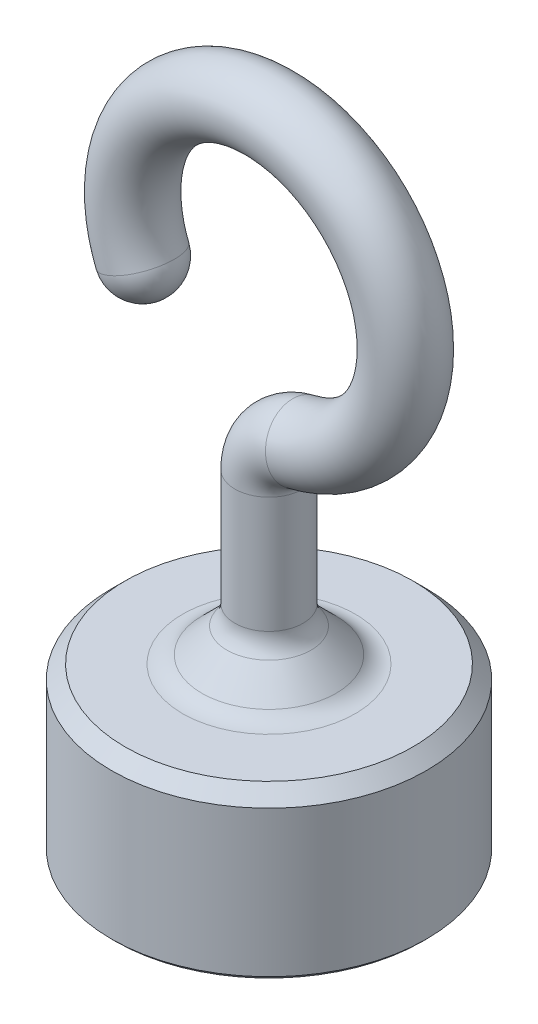
ISO-10303-21;
HEADER;
FILE_DESCRIPTION(('STEP AP214'),'2;1');
FILE_NAME('part.step','',(''),(''),'','','');
FILE_SCHEMA(('AUTOMOTIVE_DESIGN { 1 0 10303 214 1 1 1 1 }'));
ENDSEC;
DATA;
#1=APPLICATION_CONTEXT('core data for automotive mechanical design processes');
#2=APPLICATION_PROTOCOL_DEFINITION('international standard','automotive_design',2000,#1);
#3=PRODUCT_CONTEXT('',#1,'mechanical');
#4=PRODUCT('Part','Part','',(#3));
#5=PRODUCT_RELATED_PRODUCT_CATEGORY('part','',(#4));
#6=PRODUCT_DEFINITION_FORMATION('','',#4);
#7=PRODUCT_DEFINITION_CONTEXT('part definition',#1,'design');
#8=PRODUCT_DEFINITION('design','',#6,#7);
#9=PRODUCT_DEFINITION_SHAPE('','',#8);
#10=(LENGTH_UNIT() NAMED_UNIT(*) SI_UNIT(.MILLI.,.METRE.));
#11=(NAMED_UNIT(*) PLANE_ANGLE_UNIT() SI_UNIT($,.RADIAN.));
#12=(NAMED_UNIT(*) SI_UNIT($,.STERADIAN.) SOLID_ANGLE_UNIT());
#13=UNCERTAINTY_MEASURE_WITH_UNIT(LENGTH_MEASURE(1.E-05),#10,'distance_accuracy_value','');
#14=(GEOMETRIC_REPRESENTATION_CONTEXT(3) GLOBAL_UNCERTAINTY_ASSIGNED_CONTEXT((#13)) GLOBAL_UNIT_ASSIGNED_CONTEXT((#10,
#11,#12)) REPRESENTATION_CONTEXT('',''));
#15=CARTESIAN_POINT('',(0.,0.,0.));
#16=DIRECTION('',(0.,0.,1.));
#17=DIRECTION('',(1.,0.,0.));
#18=AXIS2_PLACEMENT_3D('',#15,#16,#17);
#19=CARTESIAN_POINT('',(0.,15.24,0.));
#20=DIRECTION('',(0.,-1.,0.));
#21=DIRECTION('',(0.,0.,-1.));
#22=AXIS2_PLACEMENT_3D('',#19,#20,#21);
#23=CYLINDRICAL_SURFACE('',#22,14.6685);
#24=CARTESIAN_POINT('',(0.,0.381000000000025,0.));
#25=DIRECTION('',(0.,1.,0.));
#26=DIRECTION('',(0.,0.,1.));
#27=AXIS2_PLACEMENT_3D('',#24,#25,#26);
#28=CIRCLE('',#27,14.6685);
#29=CARTESIAN_POINT('',(0.,0.381000000000024,-14.6685));
#30=VERTEX_POINT('',#29);
#31=EDGE_CURVE('E80',#30,#30,#28,.T.);
#32=CARTESIAN_POINT('',(0.,13.97,0.));
#33=DIRECTION('',(0.,1.,0.));
#34=DIRECTION('',(0.,0.,1.));
#35=AXIS2_PLACEMENT_3D('',#32,#33,#34);
#36=CIRCLE('',#35,14.6685);
#37=CARTESIAN_POINT('',(0.,13.97,-14.6685));
#38=VERTEX_POINT('',#37);
#39=EDGE_CURVE('E83',#38,#38,#36,.F.);
#40=CARTESIAN_POINT('',(0.,0.381000000000024,-14.6685));
#41=CARTESIAN_POINT('',(0.,0.522552083333357,-14.6685));
#42=CARTESIAN_POINT('',(0.,0.664104166666691,-14.6685));
#43=CARTESIAN_POINT('',(0.,0.947208333333357,-14.6685));
#44=CARTESIAN_POINT('',(0.,1.08876041666669,-14.6685));
#45=CARTESIAN_POINT('',(0.,1.37186458333336,-14.6685));
#46=CARTESIAN_POINT('',(0.,1.51341666666669,-14.6685));
#47=CARTESIAN_POINT('',(0.,1.79652083333336,-14.6685));
#48=CARTESIAN_POINT('',(0.,1.93807291666669,-14.6685));
#49=CARTESIAN_POINT('',(0.,2.22117708333336,-14.6685));
#50=CARTESIAN_POINT('',(0.,2.36272916666669,-14.6685));
#51=CARTESIAN_POINT('',(0.,2.64583333333336,-14.6685));
#52=CARTESIAN_POINT('',(0.,2.78738541666669,-14.6685));
#53=CARTESIAN_POINT('',(0.,3.07048958333336,-14.6685));
#54=CARTESIAN_POINT('',(0.,3.21204166666669,-14.6685));
#55=CARTESIAN_POINT('',(0.,3.49514583333336,-14.6685));
#56=CARTESIAN_POINT('',(0.,3.63669791666669,-14.6685));
#57=CARTESIAN_POINT('',(0.,3.91980208333336,-14.6685));
#58=CARTESIAN_POINT('',(0.,4.06135416666669,-14.6685));
#59=CARTESIAN_POINT('',(0.,4.34445833333336,-14.6685));
#60=CARTESIAN_POINT('',(0.,4.48601041666669,-14.6685));
#61=CARTESIAN_POINT('',(0.,4.76911458333336,-14.6685));
#62=CARTESIAN_POINT('',(0.,4.91066666666669,-14.6685));
#63=CARTESIAN_POINT('',(0.,5.19377083333336,-14.6685));
#64=CARTESIAN_POINT('',(0.,5.33532291666669,-14.6685));
#65=CARTESIAN_POINT('',(0.,5.61842708333336,-14.6685));
#66=CARTESIAN_POINT('',(0.,5.75997916666669,-14.6685));
#67=CARTESIAN_POINT('',(0.,6.04308333333336,-14.6685));
#68=CARTESIAN_POINT('',(0.,6.18463541666669,-14.6685));
#69=CARTESIAN_POINT('',(0.,6.46773958333336,-14.6685));
#70=CARTESIAN_POINT('',(0.,6.60929166666669,-14.6685));
#71=CARTESIAN_POINT('',(0.,6.89239583333336,-14.6685));
#72=CARTESIAN_POINT('',(0.,7.03394791666669,-14.6685));
#73=CARTESIAN_POINT('',(0.,7.31705208333335,-14.6685));
#74=CARTESIAN_POINT('',(0.,7.45860416666669,-14.6685));
#75=CARTESIAN_POINT('',(0.,7.74170833333335,-14.6685));
#76=CARTESIAN_POINT('',(0.,7.88326041666669,-14.6685));
#77=CARTESIAN_POINT('',(0.,8.16636458333335,-14.6685));
#78=CARTESIAN_POINT('',(0.,8.30791666666669,-14.6685));
#79=CARTESIAN_POINT('',(0.,8.59102083333335,-14.6685));
#80=CARTESIAN_POINT('',(0.,8.73257291666669,-14.6685));
#81=CARTESIAN_POINT('',(0.,9.01567708333335,-14.6685));
#82=CARTESIAN_POINT('',(0.,9.15722916666669,-14.6685));
#83=CARTESIAN_POINT('',(0.,9.44033333333335,-14.6685));
#84=CARTESIAN_POINT('',(0.,9.58188541666669,-14.6685));
#85=CARTESIAN_POINT('',(0.,9.86498958333335,-14.6685));
#86=CARTESIAN_POINT('',(0.,10.0065416666667,-14.6685));
#87=CARTESIAN_POINT('',(0.,10.2896458333334,-14.6685));
#88=CARTESIAN_POINT('',(0.,10.4311979166667,-14.6685));
#89=CARTESIAN_POINT('',(0.,10.7143020833334,-14.6685));
#90=CARTESIAN_POINT('',(0.,10.8558541666667,-14.6685));
#91=CARTESIAN_POINT('',(0.,11.1389583333334,-14.6685));
#92=CARTESIAN_POINT('',(0.,11.2805104166667,-14.6685));
#93=CARTESIAN_POINT('',(0.,11.5636145833334,-14.6685));
#94=CARTESIAN_POINT('',(0.,11.7051666666667,-14.6685));
#95=CARTESIAN_POINT('',(0.,11.9882708333334,-14.6685));
#96=CARTESIAN_POINT('',(0.,12.1298229166667,-14.6685));
#97=CARTESIAN_POINT('',(0.,12.4129270833334,-14.6685));
#98=CARTESIAN_POINT('',(0.,12.5544791666667,-14.6685));
#99=CARTESIAN_POINT('',(0.,12.8375833333334,-14.6685));
#100=CARTESIAN_POINT('',(0.,12.9791354166667,-14.6685));
#101=CARTESIAN_POINT('',(0.,13.2622395833334,-14.6685));
#102=CARTESIAN_POINT('',(0.,13.4037916666667,-14.6685));
#103=CARTESIAN_POINT('',(0.,13.6868958333334,-14.6685));
#104=CARTESIAN_POINT('',(0.,13.8284479166667,-14.6685));
#105=CARTESIAN_POINT('',(0.,13.97,-14.6685));
#106=B_SPLINE_CURVE_WITH_KNOTS('',3,(#40,#41,#42,#43,#44,#45,#46,#47,#48,#49,#50,#51,#52,#53,
#54,#55,#56,#57,#58,#59,#60,#61,#62,#63,#64,#65,#66,#67,#68,#69,#70,#71,#72,#73,#74,#75,#76,#77,
#78,#79,#80,#81,#82,#83,#84,#85,#86,#87,#88,#89,#90,#91,#92,#93,#94,#95,#96,#97,#98,#99,#100,
#101,#102,#103,#104,#105),.UNSPECIFIED.,.F.,.F.,(4,2,2,2,2,2,2,2,2,2,2,2,2,2,2,2,2,2,2,2,2,2,2,
2,2,2,2,2,2,2,2,2,4),(0.,0.424656250000001,0.849312499999999,1.27396875,1.698625,2.12328125,
2.5479375,2.97259375,3.39725,3.82190625,4.2465625,4.67121875,5.095875,5.52053125,5.9451875,
6.36984375,6.7945,7.21915625,7.6438125,8.06846875,8.493125,8.91778125,9.3424375,9.76709375,
10.19175,10.61640625,11.0410625,11.46571875,11.890375,12.31503125,12.7396875,13.16434375,
13.589),.UNSPECIFIED.);
#107=EDGE_CURVE('BSEAM51',#30,#38,#106,.T.);
#108=ORIENTED_EDGE('',*,*,#31,.T.);
#109=ORIENTED_EDGE('',*,*,#39,.T.);
#110=ORIENTED_EDGE('',*,*,#107,.T.);
#111=ORIENTED_EDGE('',*,*,#107,.F.);
#112=EDGE_LOOP('',(#108,#110,#109,#111));
#113=FACE_BOUND('',#112,.T.);
#114=ADVANCED_FACE('F51',(#113),#23,.T.);
#115=CARTESIAN_POINT('',(0.,15.24,0.));
#116=DIRECTION('',(0.,1.,0.));
#117=DIRECTION('',(0.,0.,1.));
#118=AXIS2_PLACEMENT_3D('',#115,#116,#117);
#119=PLANE('',#118);
#120=CARTESIAN_POINT('',(0.,15.24,0.));
#121=DIRECTION('',(0.,1.,0.));
#122=DIRECTION('',(0.,0.,1.));
#123=AXIS2_PLACEMENT_3D('',#120,#121,#122);
#124=CIRCLE('',#123,8.03710244842764);
#125=CARTESIAN_POINT('',(0.,15.24,8.03710244842764));
#126=VERTEX_POINT('',#125);
#127=EDGE_CURVE('E66',#126,#126,#124,.F.);
#128=ORIENTED_EDGE('',*,*,#127,.T.);
#129=EDGE_LOOP('',(#128));
#130=FACE_BOUND('',#129,.T.);
#131=CARTESIAN_POINT('',(0.,15.24,0.));
#132=DIRECTION('',(0.,1.,0.));
#133=DIRECTION('',(0.,0.,1.));
#134=AXIS2_PLACEMENT_3D('',#131,#132,#133);
#135=CIRCLE('',#134,13.3985);
#136=CARTESIAN_POINT('',(0.,15.24,13.3985));
#137=VERTEX_POINT('',#136);
#138=EDGE_CURVE('E86',#137,#137,#135,.T.);
#139=ORIENTED_EDGE('',*,*,#138,.T.);
#140=EDGE_LOOP('',(#139));
#141=FACE_BOUND('',#140,.T.);
#142=ADVANCED_FACE('F120',(#130,#141),#119,.T.);
#143=CARTESIAN_POINT('',(0.,0.,0.));
#144=DIRECTION('',(0.,1.,0.));
#145=DIRECTION('',(0.,0.,1.));
#146=AXIS2_PLACEMENT_3D('',#143,#144,#145);
#147=PLANE('',#146);
#148=CARTESIAN_POINT('',(0.,0.,0.));
#149=DIRECTION('',(0.,1.,0.));
#150=DIRECTION('',(0.,0.,1.));
#151=AXIS2_PLACEMENT_3D('',#148,#149,#150);
#152=CIRCLE('',#151,14.2875);
#153=CARTESIAN_POINT('',(0.,0.,14.2875));
#154=VERTEX_POINT('',#153);
#155=EDGE_CURVE('E74',#154,#154,#152,.F.);
#156=ORIENTED_EDGE('',*,*,#155,.T.);
#157=EDGE_LOOP('',(#156));
#158=FACE_BOUND('',#157,.T.);
#159=CARTESIAN_POINT('',(0.,0.,0.));
#160=DIRECTION('',(0.,1.,0.));
#161=DIRECTION('',(0.,0.,1.));
#162=AXIS2_PLACEMENT_3D('',#159,#160,#161);
#163=CIRCLE('',#162,11.2395);
#164=CARTESIAN_POINT('',(0.,0.,11.2395));
#165=VERTEX_POINT('',#164);
#166=EDGE_CURVE('E77',#165,#165,#163,.T.);
#167=ORIENTED_EDGE('',*,*,#166,.T.);
#168=EDGE_LOOP('',(#167));
#169=FACE_BOUND('',#168,.T.);
#170=ADVANCED_FACE('F126',(#158,#169),#147,.F.);
#171=CARTESIAN_POINT('',(0.,11.43,0.));
#172=DIRECTION('',(0.,1.,0.));
#173=DIRECTION('',(0.,0.,1.));
#174=AXIS2_PLACEMENT_3D('',#171,#172,#173);
#175=PLANE('',#174);
#176=CARTESIAN_POINT('',(0.,11.43,0.));
#177=DIRECTION('',(0.,1.,0.));
#178=DIRECTION('',(0.,0.,1.));
#179=AXIS2_PLACEMENT_3D('',#176,#177,#178);
#180=CIRCLE('',#179,10.15941125168);
#181=CARTESIAN_POINT('',(0.,11.43,10.15941125168));
#182=VERTEX_POINT('',#181);
#183=EDGE_CURVE('E89',#182,#182,#180,.F.);
#184=ORIENTED_EDGE('',*,*,#183,.T.);
#185=EDGE_LOOP('',(#184));
#186=FACE_BOUND('',#185,.T.);
#187=ADVANCED_FACE('F232',(#186),#175,.F.);
#188=CARTESIAN_POINT('',(0.,0.,0.));
#189=DIRECTION('',(0.,-1.,0.));
#190=DIRECTION('',(0.,0.,-1.));
#191=AXIS2_PLACEMENT_3D('',#188,#189,#190);
#192=CONICAL_SURFACE('',#191,10.8585,0.0610865238198017);
#193=CARTESIAN_POINT('',(0.,0.405821080601915,0.));
#194=DIRECTION('',(0.,1.,0.));
#195=DIRECTION('',(0.,0.,1.));
#196=AXIS2_PLACEMENT_3D('',#193,#194,#195);
#197=CIRCLE('',#196,10.8336789193981);
#198=CARTESIAN_POINT('',(0.,0.405821080601915,10.8336789193981));
#199=VERTEX_POINT('',#198);
#200=EDGE_CURVE('E71',#199,#199,#197,.F.);
#201=ORIENTED_EDGE('',*,*,#200,.T.);
#202=EDGE_LOOP('',(#201));
#203=FACE_BOUND('',#202,.T.);
#204=ORIENTED_EDGE('',*,*,#183,.F.);
#205=EDGE_LOOP('',(#204));
#206=FACE_BOUND('',#205,.T.);
#207=ADVANCED_FACE('F116',(#203,#206),#192,.F.);
#208=CARTESIAN_POINT('',(-11.786275908633,42.259915412429,0.));
#209=DIRECTION('',(0.,0.,1.));
#210=DIRECTION('',(1.,0.,0.));
#211=AXIS2_PLACEMENT_3D('',#208,#209,#210);
#212=SPHERICAL_SURFACE('',#211,3.175);
#213=CARTESIAN_POINT('',(-11.786275908633,42.259915412429,0.));
#214=DIRECTION('',(-0.372447605320555,0.928053221152206,0.));
#215=DIRECTION('',(-0.928053221152205,-0.372447605320555,0.));
#216=AXIS2_PLACEMENT_3D('',#213,#214,#215);
#217=SPHERICAL_SURFACE('',#216,3.175);
#218=CARTESIAN_POINT('',(-11.786275908633,42.259915412429,0.));
#219=DIRECTION('',(-0.372447605320555,0.928053221152205,0.));
#220=DIRECTION('',(-0.928053221152206,-0.372447605320555,0.));
#221=AXIS2_PLACEMENT_3D('',#218,#219,#220);
#222=CIRCLE('',#221,3.175);
#223=CARTESIAN_POINT('',(-14.7328448857913,41.0773942655362,0.));
#224=VERTEX_POINT('',#223);
#225=EDGE_CURVE('E90',#224,#224,#222,.T.);
#226=ORIENTED_EDGE('',*,*,#225,.F.);
#227=EDGE_LOOP('',(#226));
#228=FACE_BOUND('',#227,.T.);
#229=ADVANCED_FACE('F117',(#228),#217,.T.);
#230=CARTESIAN_POINT('',(0.,15.24,0.));
#231=DIRECTION('',(0.,1.,0.));
#232=DIRECTION('',(0.,0.,1.));
#233=AXIS2_PLACEMENT_3D('',#230,#231,#232);
#234=CYLINDRICAL_SURFACE('',#233,3.175);
#235=CARTESIAN_POINT('',(0.,20.1021024484276,0.));
#236=DIRECTION('',(0.,1.,0.));
#237=DIRECTION('',(0.,0.,1.));
#238=AXIS2_PLACEMENT_3D('',#235,#236,#237);
#239=CIRCLE('',#238,3.175);
#240=CARTESIAN_POINT('',(0.,20.1021024484276,3.175));
#241=VERTEX_POINT('',#240);
#242=EDGE_CURVE('E12',#241,#241,#239,.T.);
#243=ORIENTED_EDGE('',*,*,#242,.T.);
#244=EDGE_LOOP('',(#243));
#245=FACE_BOUND('',#244,.T.);
#246=CARTESIAN_POINT('',(0.,30.9256294863446,0.));
#247=DIRECTION('',(0.,-1.,0.));
#248=DIRECTION('',(1.,0.,0.));
#249=AXIS2_PLACEMENT_3D('',#246,#247,#248);
#250=CIRCLE('',#249,3.175);
#251=CARTESIAN_POINT('',(-3.175,30.9256294863446,0.));
#252=VERTEX_POINT('',#251);
#253=EDGE_CURVE('E98',#252,#252,#250,.T.);
#254=ORIENTED_EDGE('',*,*,#253,.T.);
#255=EDGE_LOOP('',(#254));
#256=FACE_BOUND('',#255,.T.);
#257=ADVANCED_FACE('F102',(#245,#256),#234,.T.);
#258=CARTESIAN_POINT('',(3.81,30.9256294863446,0.));
#259=DIRECTION('',(0.,0.,-1.));
#260=DIRECTION('',(-1.,0.,0.));
#261=AXIS2_PLACEMENT_3D('',#258,#259,#260);
#262=TOROIDAL_SURFACE('',#261,3.81,3.175);
#263=CARTESIAN_POINT('',(2.93076923076921,34.6327919125728,0.));
#264=DIRECTION('',(-0.97300851082104,-0.230769230769231,0.));
#265=DIRECTION('',(0.230769230769231,-0.97300851082104,0.));
#266=AXIS2_PLACEMENT_3D('',#263,#264,#265);
#267=CIRCLE('',#266,3.175);
#268=CARTESIAN_POINT('',(2.19807692307688,37.7220939344296,0.));
#269=VERTEX_POINT('',#268);
#270=EDGE_CURVE('E93',#269,#269,#267,.T.);
#271=CARTESIAN_POINT('',(3.81,30.9256294863446,0.));
#272=DIRECTION('',(0.,0.,-1.));
#273=DIRECTION('',(-1.,0.,0.));
#274=AXIS2_PLACEMENT_3D('',#271,#272,#273);
#275=CIRCLE('',#274,6.985);
#276=EDGE_CURVE('',#252,#269,#275,.T.);
#277=ORIENTED_EDGE('',*,*,#253,.F.);
#278=ORIENTED_EDGE('',*,*,#270,.T.);
#279=ORIENTED_EDGE('',*,*,#276,.T.);
#280=ORIENTED_EDGE('',*,*,#276,.F.);
#281=EDGE_LOOP('',(#277,#279,#278,#280));
#282=FACE_BOUND('',#281,.T.);
#283=ADVANCED_FACE('F104',(#282),#262,.T.);
#284=CARTESIAN_POINT('',(0.,46.99,0.));
#285=DIRECTION('',(0.,0.,1.));
#286=DIRECTION('',(1.,0.,0.));
#287=AXIS2_PLACEMENT_3D('',#284,#285,#286);
#288=TOROIDAL_SURFACE('',#287,12.7,3.175);
#289=ORIENTED_EDGE('',*,*,#225,.T.);
#290=EDGE_LOOP('',(#289));
#291=FACE_BOUND('',#290,.T.);
#292=ORIENTED_EDGE('',*,*,#270,.F.);
#293=EDGE_LOOP('',(#292));
#294=FACE_BOUND('',#293,.T.);
#295=ADVANCED_FACE('F106',(#291,#294),#288,.T.);
#296=CARTESIAN_POINT('',(0.,15.24,0.));
#297=DIRECTION('',(0.,-1.,0.));
#298=DIRECTION('',(0.,0.,-1.));
#299=AXIS2_PLACEMENT_3D('',#296,#297,#298);
#300=CONICAL_SURFACE('',#299,13.3985,0.785398163397446);
#301=ORIENTED_EDGE('',*,*,#39,.F.);
#302=EDGE_LOOP('',(#301));
#303=FACE_BOUND('',#302,.T.);
#304=ORIENTED_EDGE('',*,*,#138,.F.);
#305=EDGE_LOOP('',(#304));
#306=FACE_BOUND('',#305,.T.);
#307=ADVANCED_FACE('F113',(#303,#306),#300,.T.);
#308=CARTESIAN_POINT('',(0.,0.381000000000025,0.));
#309=DIRECTION('',(0.,1.,0.));
#310=DIRECTION('',(0.,0.,1.));
#311=AXIS2_PLACEMENT_3D('',#308,#309,#310);
#312=CONICAL_SURFACE('',#311,14.6685,0.785398163397444);
#313=ORIENTED_EDGE('',*,*,#155,.F.);
#314=EDGE_LOOP('',(#313));
#315=FACE_BOUND('',#314,.T.);
#316=ORIENTED_EDGE('',*,*,#31,.F.);
#317=EDGE_LOOP('',(#316));
#318=FACE_BOUND('',#317,.T.);
#319=ADVANCED_FACE('F141',(#315,#318),#312,.T.);
#320=CARTESIAN_POINT('',(0.,0.405821080601911,0.));
#321=DIRECTION('',(0.,-1.,0.));
#322=DIRECTION('',(0.,0.,-1.));
#323=AXIS2_PLACEMENT_3D('',#320,#321,#322);
#324=CONICAL_SURFACE('',#323,10.8336789193981,0.78539816339745);
#325=ORIENTED_EDGE('',*,*,#166,.F.);
#326=EDGE_LOOP('',(#325));
#327=FACE_BOUND('',#326,.T.);
#328=ORIENTED_EDGE('',*,*,#200,.F.);
#329=EDGE_LOOP('',(#328));
#330=FACE_BOUND('',#329,.T.);
#331=ADVANCED_FACE('F148',(#327,#330),#324,.F.);
#332=CARTESIAN_POINT('',(0.,15.24,0.));
#333=DIRECTION('',(0.,-1.,0.));
#334=DIRECTION('',(0.,0.,-1.));
#335=AXIS2_PLACEMENT_3D('',#332,#333,#334);
#336=CONICAL_SURFACE('',#335,6.98499999999998,0.785398163397454);
#337=CARTESIAN_POINT('',(0.,15.9839487757862,0.));
#338=DIRECTION('',(0.,1.,0.));
#339=DIRECTION('',(0.,0.,1.));
#340=AXIS2_PLACEMENT_3D('',#337,#338,#339);
#341=CIRCLE('',#340,6.24105122421382);
#342=CARTESIAN_POINT('',(0.,15.9839487757862,6.24105122421382));
#343=VERTEX_POINT('',#342);
#344=EDGE_CURVE('E58',#343,#343,#341,.T.);
#345=ORIENTED_EDGE('',*,*,#344,.T.);
#346=EDGE_LOOP('',(#345));
#347=FACE_BOUND('',#346,.T.);
#348=CARTESIAN_POINT('',(0.,18.3060512242138,0.));
#349=DIRECTION('',(0.,-1.,0.));
#350=DIRECTION('',(0.,0.,-1.));
#351=AXIS2_PLACEMENT_3D('',#348,#349,#350);
#352=CIRCLE('',#351,3.91894877578618);
#353=CARTESIAN_POINT('',(0.,18.3060512242138,-3.91894877578618));
#354=VERTEX_POINT('',#353);
#355=EDGE_CURVE('E62',#354,#354,#352,.T.);
#356=ORIENTED_EDGE('',*,*,#355,.T.);
#357=EDGE_LOOP('',(#356));
#358=FACE_BOUND('',#357,.T.);
#359=ADVANCED_FACE('F155',(#347,#358),#336,.T.);
#360=CARTESIAN_POINT('',(0.,17.78,0.));
#361=DIRECTION('',(0.,1.,0.));
#362=DIRECTION('',(0.,0.,1.));
#363=AXIS2_PLACEMENT_3D('',#360,#361,#362);
#364=TOROIDAL_SURFACE('',#363,8.03710244842764,2.54);
#365=ORIENTED_EDGE('',*,*,#344,.F.);
#366=EDGE_LOOP('',(#365));
#367=FACE_BOUND('',#366,.T.);
#368=ORIENTED_EDGE('',*,*,#127,.F.);
#369=EDGE_LOOP('',(#368));
#370=FACE_BOUND('',#369,.T.);
#371=ADVANCED_FACE('F160',(#367,#370),#364,.F.);
#372=CARTESIAN_POINT('',(0.,20.1021024484276,0.));
#373=DIRECTION('',(0.,1.,0.));
#374=DIRECTION('',(0.,0.,1.));
#375=AXIS2_PLACEMENT_3D('',#372,#373,#374);
#376=TOROIDAL_SURFACE('',#375,5.715,2.54);
#377=ORIENTED_EDGE('',*,*,#355,.F.);
#378=EDGE_LOOP('',(#377));
#379=FACE_BOUND('',#378,.T.);
#380=ORIENTED_EDGE('',*,*,#242,.F.);
#381=EDGE_LOOP('',(#380));
#382=FACE_BOUND('',#381,.T.);
#383=ADVANCED_FACE('F53',(#379,#382),#376,.F.);
#384=CLOSED_SHELL('',(#114,#142,#170,#187,#207,#229,#257,#283,#295,#307,#319,#331,#359,#371,#383));
#385=MANIFOLD_SOLID_BREP('B2',#384);
#386=ADVANCED_BREP_SHAPE_REPRESENTATION('',(#18,#385),#14);
#387=SHAPE_DEFINITION_REPRESENTATION(#9,#386);
ENDSEC;
END-ISO-10303-21;
